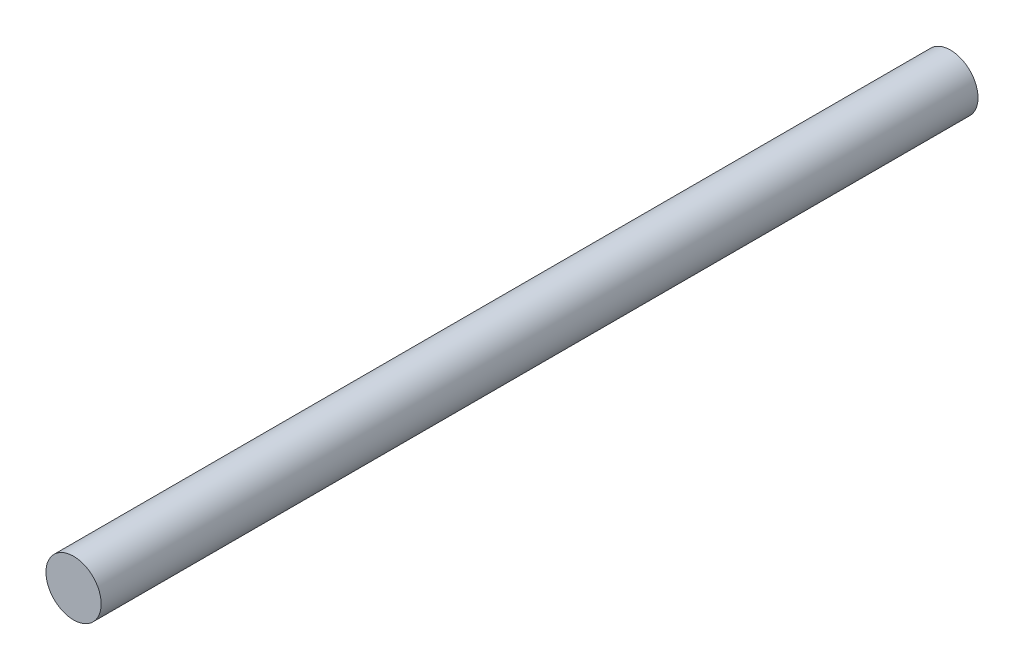
ISO-10303-21;
HEADER;
FILE_DESCRIPTION(('STEP AP214'),'2;1');
FILE_NAME('part.step','',(''),(''),'','','');
FILE_SCHEMA(('AUTOMOTIVE_DESIGN { 1 0 10303 214 1 1 1 1 }'));
ENDSEC;
DATA;
#1=APPLICATION_CONTEXT('core data for automotive mechanical design processes');
#2=APPLICATION_PROTOCOL_DEFINITION('international standard','automotive_design',2000,#1);
#3=PRODUCT_CONTEXT('',#1,'mechanical');
#4=PRODUCT('Part','Part','',(#3));
#5=PRODUCT_RELATED_PRODUCT_CATEGORY('part','',(#4));
#6=PRODUCT_DEFINITION_FORMATION('','',#4);
#7=PRODUCT_DEFINITION_CONTEXT('part definition',#1,'design');
#8=PRODUCT_DEFINITION('design','',#6,#7);
#9=PRODUCT_DEFINITION_SHAPE('','',#8);
#10=(LENGTH_UNIT() NAMED_UNIT(*) SI_UNIT(.MILLI.,.METRE.));
#11=(NAMED_UNIT(*) PLANE_ANGLE_UNIT() SI_UNIT($,.RADIAN.));
#12=(NAMED_UNIT(*) SI_UNIT($,.STERADIAN.) SOLID_ANGLE_UNIT());
#13=UNCERTAINTY_MEASURE_WITH_UNIT(LENGTH_MEASURE(1.E-05),#10,'distance_accuracy_value','');
#14=(GEOMETRIC_REPRESENTATION_CONTEXT(3) GLOBAL_UNCERTAINTY_ASSIGNED_CONTEXT((#13)) GLOBAL_UNIT_ASSIGNED_CONTEXT((#10,
#11,#12)) REPRESENTATION_CONTEXT('',''));
#15=CARTESIAN_POINT('',(0.,0.,0.));
#16=DIRECTION('',(0.,0.,1.));
#17=DIRECTION('',(1.,0.,0.));
#18=AXIS2_PLACEMENT_3D('',#15,#16,#17);
#19=CARTESIAN_POINT('',(0.,0.,31.75));
#20=DIRECTION('',(0.,0.,-1.));
#21=DIRECTION('',(-1.,0.,0.));
#22=AXIS2_PLACEMENT_3D('',#19,#20,#21);
#23=CYLINDRICAL_SURFACE('',#22,2.);
#24=CARTESIAN_POINT('',(0.,0.,31.75));
#25=DIRECTION('',(0.,0.,1.));
#26=DIRECTION('',(1.,0.,0.));
#27=AXIS2_PLACEMENT_3D('',#24,#25,#26);
#28=CIRCLE('',#27,2.);
#29=CARTESIAN_POINT('',(2.,0.,31.75));
#30=VERTEX_POINT('',#29);
#31=EDGE_CURVE('E10',#30,#30,#28,.T.);
#32=ORIENTED_EDGE('',*,*,#31,.F.);
#33=EDGE_LOOP('',(#32));
#34=FACE_BOUND('',#33,.T.);
#35=CARTESIAN_POINT('',(0.,0.,-31.75));
#36=DIRECTION('',(0.,0.,1.));
#37=DIRECTION('',(1.,0.,0.));
#38=AXIS2_PLACEMENT_3D('',#35,#36,#37);
#39=CIRCLE('',#38,2.);
#40=CARTESIAN_POINT('',(2.,0.,-31.75));
#41=VERTEX_POINT('',#40);
#42=EDGE_CURVE('E34',#41,#41,#39,.T.);
#43=ORIENTED_EDGE('',*,*,#42,.T.);
#44=EDGE_LOOP('',(#43));
#45=FACE_BOUND('',#44,.T.);
#46=ADVANCED_FACE('F31',(#34,#45),#23,.T.);
#47=CARTESIAN_POINT('',(0.,0.,31.75));
#48=DIRECTION('',(0.,0.,1.));
#49=DIRECTION('',(1.,0.,0.));
#50=AXIS2_PLACEMENT_3D('',#47,#48,#49);
#51=PLANE('',#50);
#52=ORIENTED_EDGE('',*,*,#31,.T.);
#53=EDGE_LOOP('',(#52));
#54=FACE_BOUND('',#53,.T.);
#55=ADVANCED_FACE('F46',(#54),#51,.T.);
#56=CARTESIAN_POINT('',(0.,0.,-31.75));
#57=DIRECTION('',(0.,0.,1.));
#58=DIRECTION('',(1.,0.,0.));
#59=AXIS2_PLACEMENT_3D('',#56,#57,#58);
#60=PLANE('',#59);
#61=ORIENTED_EDGE('',*,*,#42,.F.);
#62=EDGE_LOOP('',(#61));
#63=FACE_BOUND('',#62,.T.);
#64=ADVANCED_FACE('F44',(#63),#60,.F.);
#65=CLOSED_SHELL('',(#46,#55,#64));
#66=MANIFOLD_SOLID_BREP('B2',#65);
#67=ADVANCED_BREP_SHAPE_REPRESENTATION('',(#18,#66),#14);
#68=SHAPE_DEFINITION_REPRESENTATION(#9,#67);
ENDSEC;
END-ISO-10303-21;
